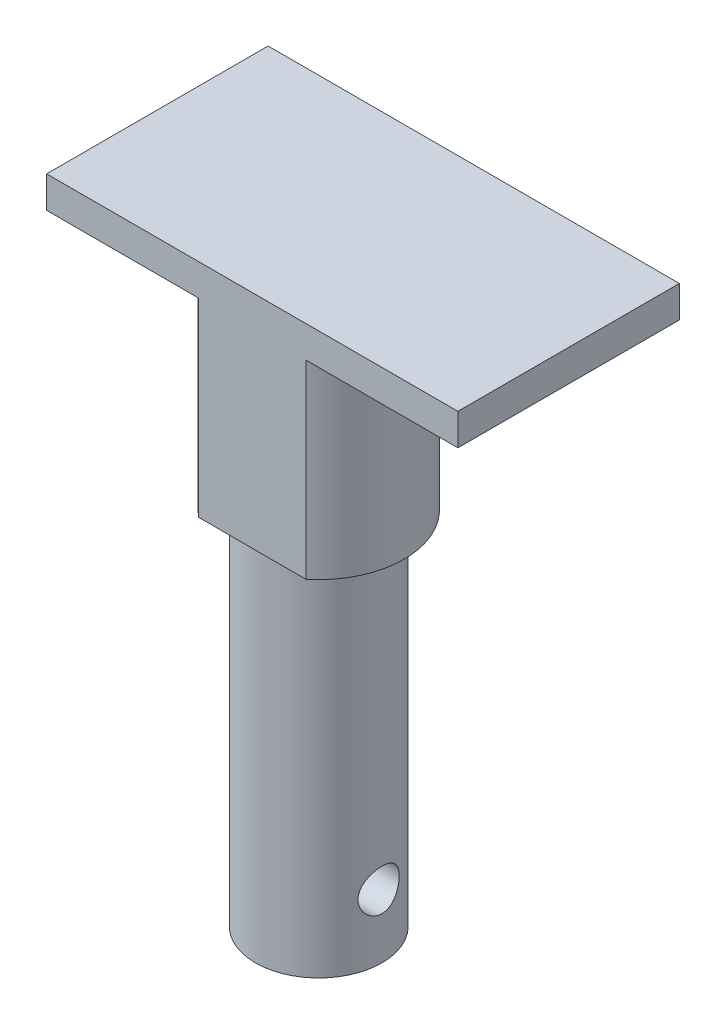
ISO-10303-21;
HEADER;
FILE_DESCRIPTION(('STEP AP214'),'2;1');
FILE_NAME('part.step','',(''),(''),'','','');
FILE_SCHEMA(('AUTOMOTIVE_DESIGN { 1 0 10303 214 1 1 1 1 }'));
ENDSEC;
DATA;
#1=APPLICATION_CONTEXT('core data for automotive mechanical design processes');
#2=APPLICATION_PROTOCOL_DEFINITION('international standard','automotive_design',2000,#1);
#3=PRODUCT_CONTEXT('',#1,'mechanical');
#4=PRODUCT('Part','Part','',(#3));
#5=PRODUCT_RELATED_PRODUCT_CATEGORY('part','',(#4));
#6=PRODUCT_DEFINITION_FORMATION('','',#4);
#7=PRODUCT_DEFINITION_CONTEXT('part definition',#1,'design');
#8=PRODUCT_DEFINITION('design','',#6,#7);
#9=PRODUCT_DEFINITION_SHAPE('','',#8);
#10=(LENGTH_UNIT() NAMED_UNIT(*) SI_UNIT(.MILLI.,.METRE.));
#11=(NAMED_UNIT(*) PLANE_ANGLE_UNIT() SI_UNIT($,.RADIAN.));
#12=(NAMED_UNIT(*) SI_UNIT($,.STERADIAN.) SOLID_ANGLE_UNIT());
#13=UNCERTAINTY_MEASURE_WITH_UNIT(LENGTH_MEASURE(1.E-05),#10,'distance_accuracy_value','');
#14=(GEOMETRIC_REPRESENTATION_CONTEXT(3) GLOBAL_UNCERTAINTY_ASSIGNED_CONTEXT((#13)) GLOBAL_UNIT_ASSIGNED_CONTEXT((#10,
#11,#12)) REPRESENTATION_CONTEXT('',''));
#15=CARTESIAN_POINT('',(0.,0.,0.));
#16=DIRECTION('',(0.,0.,1.));
#17=DIRECTION('',(1.,0.,0.));
#18=AXIS2_PLACEMENT_3D('',#15,#16,#17);
#19=CARTESIAN_POINT('',(0.,87.,0.));
#20=DIRECTION('',(0.,-1.,0.));
#21=DIRECTION('',(0.,0.,-1.));
#22=AXIS2_PLACEMENT_3D('',#19,#20,#21);
#23=CYLINDRICAL_SURFACE('',#22,13.5);
#24=DIRECTION('',(0.,-1.,0.));
#25=VECTOR('',#24,1.);
#26=CARTESIAN_POINT('',(-8.48528137423857,87.,10.5));
#27=LINE('',#26,#25);
#28=CARTESIAN_POINT('',(-8.48528137423857,87.,10.5));
#29=VERTEX_POINT('',#28);
#30=CARTESIAN_POINT('',(-8.48528137423857,57.,10.5));
#31=VERTEX_POINT('',#30);
#32=EDGE_CURVE('E52',#29,#31,#27,.T.);
#33=ORIENTED_EDGE('',*,*,#32,.F.);
#34=CARTESIAN_POINT('',(0.,87.,0.));
#35=DIRECTION('',(0.,1.,0.));
#36=DIRECTION('',(0.,0.,1.));
#37=AXIS2_PLACEMENT_3D('',#34,#35,#36);
#38=CIRCLE('',#37,13.5);
#39=CARTESIAN_POINT('',(8.48528137423857,87.,10.5));
#40=VERTEX_POINT('',#39);
#41=EDGE_CURVE('E120',#40,#29,#38,.T.);
#42=ORIENTED_EDGE('',*,*,#41,.F.);
#43=DIRECTION('',(0.,-1.,0.));
#44=VECTOR('',#43,1.);
#45=CARTESIAN_POINT('',(8.48528137423857,87.,10.5));
#46=LINE('',#45,#44);
#47=CARTESIAN_POINT('',(8.48528137423857,57.,10.5));
#48=VERTEX_POINT('',#47);
#49=EDGE_CURVE('E111',#48,#40,#46,.F.);
#50=ORIENTED_EDGE('',*,*,#49,.F.);
#51=CARTESIAN_POINT('',(0.,57.,0.));
#52=DIRECTION('',(0.,1.,0.));
#53=DIRECTION('',(0.,0.,1.));
#54=AXIS2_PLACEMENT_3D('',#51,#52,#53);
#55=CIRCLE('',#54,13.5);
#56=EDGE_CURVE('E124',#48,#31,#55,.T.);
#57=ORIENTED_EDGE('',*,*,#56,.T.);
#58=EDGE_LOOP('',(#33,#42,#50,#57));
#59=FACE_BOUND('',#58,.T.);
#60=ADVANCED_FACE('F37',(#59),#23,.T.);
#61=CARTESIAN_POINT('',(0.,57.,0.));
#62=DIRECTION('',(0.,1.,0.));
#63=DIRECTION('',(0.,0.,1.));
#64=AXIS2_PLACEMENT_3D('',#61,#62,#63);
#65=PLANE('',#64);
#66=CARTESIAN_POINT('',(0.,57.,0.));
#67=DIRECTION('',(0.,1.,0.));
#68=DIRECTION('',(0.,0.,1.));
#69=AXIS2_PLACEMENT_3D('',#66,#67,#68);
#70=CIRCLE('',#69,10.);
#71=CARTESIAN_POINT('',(0.,57.,10.));
#72=VERTEX_POINT('',#71);
#73=EDGE_CURVE('E46',#72,#72,#70,.T.);
#74=ORIENTED_EDGE('',*,*,#73,.T.);
#75=EDGE_LOOP('',(#74));
#76=FACE_BOUND('',#75,.T.);
#77=DIRECTION('',(1.,0.,0.));
#78=VECTOR('',#77,1.);
#79=CARTESIAN_POINT('',(0.,57.,10.5));
#80=LINE('',#79,#78);
#81=EDGE_CURVE('E11',#31,#48,#80,.T.);
#82=ORIENTED_EDGE('',*,*,#81,.F.);
#83=ORIENTED_EDGE('',*,*,#56,.F.);
#84=EDGE_LOOP('',(#82,#83));
#85=FACE_BOUND('',#84,.T.);
#86=ADVANCED_FACE('F148',(#76,#85),#65,.F.);
#87=CARTESIAN_POINT('',(0.,57.,0.));
#88=DIRECTION('',(0.,-1.,0.));
#89=DIRECTION('',(0.,0.,-1.));
#90=AXIS2_PLACEMENT_3D('',#87,#88,#89);
#91=CYLINDRICAL_SURFACE('',#90,10.);
#92=CARTESIAN_POINT('',(-9.45714015968886,10.,-3.25));
#93=CARTESIAN_POINT('',(-9.45714031975425,10.1772995309839,-3.2499999659442));
#94=CARTESIAN_POINT('',(-9.46218061553845,10.3546010790585,-3.23544233910947));
#95=CARTESIAN_POINT('',(-9.48169889974066,10.703969232438,-3.17778063387206));
#96=CARTESIAN_POINT('',(-9.49617883832327,10.8760347483252,-3.13467065672283));
#97=CARTESIAN_POINT('',(-9.5327668473651,11.2098161179656,-3.0215640876378));
#98=CARTESIAN_POINT('',(-9.55486055631605,11.3715507823397,-2.95161808731896));
#99=CARTESIAN_POINT('',(-9.60416619680662,11.6810392881496,-2.78699619388974));
#100=CARTESIAN_POINT('',(-9.63137916829215,11.8287902797076,-2.69231527451471));
#101=CARTESIAN_POINT('',(-9.68899176574426,12.1116102021404,-2.47714104411863));
#102=CARTESIAN_POINT('',(-9.7194679228496,12.2460831711087,-2.35588471696472));
#103=CARTESIAN_POINT('',(-9.77952436884652,12.4931889671246,-2.09263184494554));
#104=CARTESIAN_POINT('',(-9.80910452115729,12.6058184785023,-1.95063215712304));
#105=CARTESIAN_POINT('',(-9.86491782280745,12.8087140059434,-1.64559602796293));
#106=CARTESIAN_POINT('',(-9.89105042825693,12.8983599381405,-1.4821271180699));
#107=CARTESIAN_POINT('',(-9.93612574183379,13.0486489618789,-1.14143632793768));
#108=CARTESIAN_POINT('',(-9.95507028595168,13.1092994605284,-0.964217973560282));
#109=CARTESIAN_POINT('',(-9.98309301263069,13.1978676790573,-0.607303975463921));
#110=CARTESIAN_POINT('',(-9.99247790860662,13.2268053813106,-0.427885967277268));
#111=CARTESIAN_POINT('',(-10.0014104232845,13.2543650856266,-0.0665120376229357));
#112=CARTESIAN_POINT('',(-10.0009604553388,13.2529945249563,0.115443250276203));
#113=CARTESIAN_POINT('',(-9.99048411795755,13.2206333572229,0.469523771450081));
#114=CARTESIAN_POINT('',(-9.98081565195022,13.1907497247953,0.64176248294037));
#115=CARTESIAN_POINT('',(-9.95343429447756,13.1040354917331,0.978632246401624));
#116=CARTESIAN_POINT('',(-9.93572086532967,13.0472030899749,1.14326278907262));
#117=CARTESIAN_POINT('',(-9.89377411201858,12.9075321138005,1.46271759756166));
#118=CARTESIAN_POINT('',(-9.869460261881,12.824370079097,1.61738943124247));
#119=CARTESIAN_POINT('',(-9.81685615924599,12.6346641048776,1.91091693128666));
#120=CARTESIAN_POINT('',(-9.78856484119447,12.5281138954183,2.04976834129096));
#121=CARTESIAN_POINT('',(-9.72950106071725,12.289034672668,2.31430549384569));
#122=CARTESIAN_POINT('',(-9.69867422994171,12.1555541692841,2.4391204093666));
#123=CARTESIAN_POINT('',(-9.63909486372543,11.8692829094806,2.66486690355386));
#124=CARTESIAN_POINT('',(-9.61034261635581,11.7164894793945,2.76579516980328));
#125=CARTESIAN_POINT('',(-9.55787955588513,11.3932925275095,2.94202938013299));
#126=CARTESIAN_POINT('',(-9.53423890921102,11.222686441961,3.01698630603797));
#127=CARTESIAN_POINT('',(-9.49549194347806,10.8703153229128,3.13682094119598));
#128=CARTESIAN_POINT('',(-9.48038225830742,10.6885547221466,3.18171051560576));
#129=CARTESIAN_POINT('',(-9.46116378995736,10.3274324605214,3.23840120551586));
#130=CARTESIAN_POINT('',(-9.45660869381158,10.1483053768679,3.2515457753366));
#131=CARTESIAN_POINT('',(-9.45777099529463,9.7903836982702,3.24816506242597));
#132=CARTESIAN_POINT('',(-9.46348664335148,9.61158905189046,3.23164483295112));
#133=CARTESIAN_POINT('',(-9.48410320755962,9.26538409966181,3.17060807190337));
#134=CARTESIAN_POINT('',(-9.49870345169873,9.09779258764446,3.12700704786871));
#135=CARTESIAN_POINT('',(-9.53511831835134,8.77233155932164,3.01413526079061));
#136=CARTESIAN_POINT('',(-9.55693417915461,8.61446371723909,2.94486009149768));
#137=CARTESIAN_POINT('',(-9.60614721606396,8.3075968343669,2.78020029035675));
#138=CARTESIAN_POINT('',(-9.63369436385388,8.15901530427584,2.68408357895599));
#139=CARTESIAN_POINT('',(-9.69096725740346,7.87960276565996,2.46930881957965));
#140=CARTESIAN_POINT('',(-9.7206936131738,7.74877675676222,2.35064444508003));
#141=CARTESIAN_POINT('',(-9.780607139663,7.50245906587849,2.08774508026601));
#142=CARTESIAN_POINT('',(-9.8107540300733,7.38793237086563,1.94259422975942));
#143=CARTESIAN_POINT('',(-9.86677456184763,7.18480943727656,1.63439731618795));
#144=CARTESIAN_POINT('',(-9.89264837523296,7.09621215474873,1.47135197394192));
#145=CARTESIAN_POINT('',(-9.93707445650379,6.94829394845271,1.13289346303608));
#146=CARTESIAN_POINT('',(-9.95567674524018,6.8887722789617,0.957574938068063));
#147=CARTESIAN_POINT('',(-9.98368172068449,6.80028357541559,0.598697534609192));
#148=CARTESIAN_POINT('',(-9.99308754661658,6.77130611479243,0.415141490398973));
#149=CARTESIAN_POINT('',(-10.0014145744501,6.7456300739525,0.0538483383324492));
#150=CARTESIAN_POINT('',(-10.0007868427667,6.74754284113222,-0.123780796472686));
#151=CARTESIAN_POINT('',(-9.99021560869602,6.7801948794347,-0.476070007471436));
#152=CARTESIAN_POINT('',(-9.98027280013974,6.81093200358289,-0.650730303811703));
#153=CARTESIAN_POINT('',(-9.95234501872029,6.89945321826155,-0.98962088757608));
#154=CARTESIAN_POINT('',(-9.93447846708206,6.95683960647199,-1.15396550686853));
#155=CARTESIAN_POINT('',(-9.8925433503312,7.09666612050663,-1.47076416800393));
#156=CARTESIAN_POINT('',(-9.86847368418031,7.1791106945664,-1.62321609265708));
#157=CARTESIAN_POINT('',(-9.81555378161621,7.37011445259099,-1.91784189154064));
#158=CARTESIAN_POINT('',(-9.78656335044512,7.47950220761108,-2.05945312297857));
#159=CARTESIAN_POINT('',(-9.72743554627142,7.71985690512826,-2.32276630111765));
#160=CARTESIAN_POINT('',(-9.69729781882271,7.85083055867531,-2.44446203257074));
#161=CARTESIAN_POINT('',(-9.63796513947998,8.13638781097536,-2.66901287727712));
#162=CARTESIAN_POINT('',(-9.60884528614325,8.29166107253147,-2.77101345238615));
#163=CARTESIAN_POINT('',(-9.55622558839879,8.61804094314108,-2.94738303474979));
#164=CARTESIAN_POINT('',(-9.53272393962414,8.78914244417665,-3.02176091768745));
#165=CARTESIAN_POINT('',(-9.49550334814008,9.1315420841047,-3.13669494452506));
#166=CARTESIAN_POINT('',(-9.48127131053795,9.3021799092042,-3.17905105398648));
#167=CARTESIAN_POINT('',(-9.46209103822373,9.64854553088193,-3.23569936279266));
#168=CARTESIAN_POINT('',(-9.45714000104205,9.8242717746928,-3.25000003375398));
#169=CARTESIAN_POINT('',(-9.45714015968886,10.,-3.25));
#170=B_SPLINE_CURVE_WITH_KNOTS('',3,(#92,#93,#94,#95,#96,#97,#98,#99,#100,#101,#102,#103,#104,
#105,#106,#107,#108,#109,#110,#111,#112,#113,#114,#115,#116,#117,#118,#119,#120,#121,#122,#123,
#124,#125,#126,#127,#128,#129,#130,#131,#132,#133,#134,#135,#136,#137,#138,#139,#140,#141,#142,
#143,#144,#145,#146,#147,#148,#149,#150,#151,#152,#153,#154,#155,#156,#157,#158,#159,#160,#161,
#162,#163,#164,#165,#166,#167,#168,#169),.UNSPECIFIED.,.T.,.F.,(4,2,2,2,2,2,2,2,2,2,2,2,2,2,2,2,
2,2,2,2,2,2,2,2,2,2,2,2,2,2,2,2,2,2,2,2,2,2,4),(0.,0.531248505037184,1.06260679711988,
1.59296824911441,2.12343755726667,2.67180188546718,3.22024938614486,3.7822237298498,
4.34405443604299,4.88723029743208,5.43027287176746,5.95305557209681,6.47587321758633,
7.00538064397246,7.53503019539512,8.088456109055,8.64195872265875,9.20263474595129,
9.76308938511448,10.2993744444867,10.8355681589328,11.3545536787972,11.8736283092985,
12.4085390846316,12.9436001698433,13.5029364155139,14.0622501384863,14.6176456234264,
15.1728514571604,15.7031706450783,16.2334503354496,16.7560588347683,17.278760159833,
17.8201569265527,18.3617223320029,18.9231471315414,19.4843913784856,20.0110907944363,
20.5376311438056),.UNSPECIFIED.);
#171=CARTESIAN_POINT('',(-9.45714015968886,10.,-3.25));
#172=VERTEX_POINT('',#171);
#173=EDGE_CURVE('E127',#172,#172,#170,.T.);
#174=ORIENTED_EDGE('',*,*,#173,.T.);
#175=EDGE_LOOP('',(#174));
#176=FACE_BOUND('',#175,.T.);
#177=CARTESIAN_POINT('',(9.45714015968887,10.,-3.25));
#178=CARTESIAN_POINT('',(9.45714031975425,9.82270046901606,-3.2499999659442));
#179=CARTESIAN_POINT('',(9.46218061553845,9.64539892094155,-3.23544233910947));
#180=CARTESIAN_POINT('',(9.48169889974066,9.29603076756202,-3.17778063387206));
#181=CARTESIAN_POINT('',(9.49617883832327,9.12396525167484,-3.13467065672283));
#182=CARTESIAN_POINT('',(9.5327668473651,8.79018388203441,-3.0215640876378));
#183=CARTESIAN_POINT('',(9.55486055631605,8.62844921766033,-2.95161808731896));
#184=CARTESIAN_POINT('',(9.60416619680663,8.31896071185041,-2.78699619388974));
#185=CARTESIAN_POINT('',(9.63137916829215,8.17120972029238,-2.69231527451471));
#186=CARTESIAN_POINT('',(9.68899176574426,7.88838979785957,-2.47714104411863));
#187=CARTESIAN_POINT('',(9.7194679228496,7.75391682889129,-2.35588471696472));
#188=CARTESIAN_POINT('',(9.77952436884652,7.50681103287539,-2.09263184494554));
#189=CARTESIAN_POINT('',(9.80910452115729,7.39418152149766,-1.95063215712304));
#190=CARTESIAN_POINT('',(9.86491782280745,7.19128599405659,-1.64559602796293));
#191=CARTESIAN_POINT('',(9.89105042825693,7.10164006185954,-1.4821271180699));
#192=CARTESIAN_POINT('',(9.93612574183379,6.95135103812108,-1.14143632793768));
#193=CARTESIAN_POINT('',(9.95507028595168,6.8907005394716,-0.964217973560284));
#194=CARTESIAN_POINT('',(9.98309301263069,6.80213232094275,-0.607303975463923));
#195=CARTESIAN_POINT('',(9.99247790860662,6.77319461868942,-0.427885967277271));
#196=CARTESIAN_POINT('',(10.0014104232845,6.74563491437338,-0.0665120376229382));
#197=CARTESIAN_POINT('',(10.0009604553388,6.74700547504368,0.115443250276201));
#198=CARTESIAN_POINT('',(9.99048411795755,6.77936664277708,0.46952377145008));
#199=CARTESIAN_POINT('',(9.98081565195022,6.80925027520472,0.641762482940369));
#200=CARTESIAN_POINT('',(9.95343429447756,6.89596450826688,0.978632246401624));
#201=CARTESIAN_POINT('',(9.93572086532967,6.95279691002511,1.14326278907262));
#202=CARTESIAN_POINT('',(9.89377411201858,7.09246788619951,1.46271759756166));
#203=CARTESIAN_POINT('',(9.869460261881,7.17562992090305,1.61738943124247));
#204=CARTESIAN_POINT('',(9.81685615924599,7.36533589512239,1.91091693128666));
#205=CARTESIAN_POINT('',(9.78856484119447,7.47188610458166,2.04976834129096));
#206=CARTESIAN_POINT('',(9.72950106071725,7.71096532733197,2.31430549384569));
#207=CARTESIAN_POINT('',(9.69867422994171,7.84444583071594,2.4391204093666));
#208=CARTESIAN_POINT('',(9.63909486372543,8.13071709051935,2.66486690355386));
#209=CARTESIAN_POINT('',(9.61034261635581,8.28351052060549,2.76579516980328));
#210=CARTESIAN_POINT('',(9.55787955588513,8.60670747249051,2.94202938013299));
#211=CARTESIAN_POINT('',(9.53423890921102,8.77731355803904,3.01698630603797));
#212=CARTESIAN_POINT('',(9.49549194347806,9.12968467708717,3.13682094119597));
#213=CARTESIAN_POINT('',(9.48038225830742,9.31144527785337,3.18171051560576));
#214=CARTESIAN_POINT('',(9.46116378995736,9.67256753947856,3.23840120551586));
#215=CARTESIAN_POINT('',(9.45660869381158,9.85169462313214,3.2515457753366));
#216=CARTESIAN_POINT('',(9.45777099529463,10.2096163017298,3.24816506242597));
#217=CARTESIAN_POINT('',(9.46348664335147,10.3884109481095,3.23164483295112));
#218=CARTESIAN_POINT('',(9.48410320755962,10.7346159003382,3.17060807190337));
#219=CARTESIAN_POINT('',(9.49870345169873,10.9022074123555,3.12700704786872));
#220=CARTESIAN_POINT('',(9.53511831835134,11.2276684406784,3.01413526079061));
#221=CARTESIAN_POINT('',(9.55693417915461,11.3855362827609,2.94486009149769));
#222=CARTESIAN_POINT('',(9.60614721606395,11.6924031656331,2.78020029035675));
#223=CARTESIAN_POINT('',(9.63369436385388,11.8409846957242,2.684083578956));
#224=CARTESIAN_POINT('',(9.69096725740346,12.12039723434,2.46930881957966));
#225=CARTESIAN_POINT('',(9.7206936131738,12.2512232432378,2.35064444508003));
#226=CARTESIAN_POINT('',(9.780607139663,12.4975409341215,2.08774508026601));
#227=CARTESIAN_POINT('',(9.8107540300733,12.6120676291344,1.94259422975942));
#228=CARTESIAN_POINT('',(9.86677456184763,12.8151905627234,1.63439731618795));
#229=CARTESIAN_POINT('',(9.89264837523296,12.9037878452513,1.47135197394192));
#230=CARTESIAN_POINT('',(9.93707445650379,13.0517060515473,1.13289346303609));
#231=CARTESIAN_POINT('',(9.95567674524017,13.1112277210383,0.957574938068066));
#232=CARTESIAN_POINT('',(9.98368172068449,13.1997164245844,0.598697534609195));
#233=CARTESIAN_POINT('',(9.99308754661658,13.2286938852076,0.415141490398976));
#234=CARTESIAN_POINT('',(10.0014145744501,13.2543699260475,0.0538483383324525));
#235=CARTESIAN_POINT('',(10.0007868427667,13.2524571588678,-0.123780796472683));
#236=CARTESIAN_POINT('',(9.99021560869602,13.2198051205653,-0.476070007471433));
#237=CARTESIAN_POINT('',(9.98027280013974,13.1890679964171,-0.650730303811699));
#238=CARTESIAN_POINT('',(9.95234501872029,13.1005467817384,-0.989620887576076));
#239=CARTESIAN_POINT('',(9.93447846708206,13.043160393528,-1.15396550686852));
#240=CARTESIAN_POINT('',(9.8925433503312,12.9033338794934,-1.47076416800392));
#241=CARTESIAN_POINT('',(9.86847368418031,12.8208893054336,-1.62321609265707));
#242=CARTESIAN_POINT('',(9.81555378161621,12.629885547409,-1.91784189154063));
#243=CARTESIAN_POINT('',(9.78656335044512,12.5204977923889,-2.05945312297857));
#244=CARTESIAN_POINT('',(9.72743554627142,12.2801430948718,-2.32276630111765));
#245=CARTESIAN_POINT('',(9.69729781882271,12.1491694413247,-2.44446203257074));
#246=CARTESIAN_POINT('',(9.63796513947998,11.8636121890246,-2.66901287727712));
#247=CARTESIAN_POINT('',(9.60884528614325,11.7083389274685,-2.77101345238615));
#248=CARTESIAN_POINT('',(9.55622558839879,11.3819590568589,-2.94738303474979));
#249=CARTESIAN_POINT('',(9.53272393962414,11.2108575558233,-3.02176091768745));
#250=CARTESIAN_POINT('',(9.49550334814008,10.8684579158953,-3.13669494452506));
#251=CARTESIAN_POINT('',(9.48127131053795,10.6978200907958,-3.17905105398647));
#252=CARTESIAN_POINT('',(9.46209103822373,10.3514544691181,-3.23569936279266));
#253=CARTESIAN_POINT('',(9.45714000104206,10.1757282253072,-3.25000003375398));
#254=CARTESIAN_POINT('',(9.45714015968887,10.,-3.25));
#255=B_SPLINE_CURVE_WITH_KNOTS('',3,(#177,#178,#179,#180,#181,#182,#183,#184,#185,#186,#187,
#188,#189,#190,#191,#192,#193,#194,#195,#196,#197,#198,#199,#200,#201,#202,#203,#204,#205,#206,
#207,#208,#209,#210,#211,#212,#213,#214,#215,#216,#217,#218,#219,#220,#221,#222,#223,#224,#225,
#226,#227,#228,#229,#230,#231,#232,#233,#234,#235,#236,#237,#238,#239,#240,#241,#242,#243,#244,
#245,#246,#247,#248,#249,#250,#251,#252,#253,#254),.UNSPECIFIED.,.T.,.F.,(4,2,2,2,2,2,2,2,2,2,2,
2,2,2,2,2,2,2,2,2,2,2,2,2,2,2,2,2,2,2,2,2,2,2,2,2,2,2,4),(0.,0.531248505037183,1.06260679711988,
1.59296824911441,2.12343755726667,2.67180188546718,3.22024938614486,3.7822237298498,
4.34405443604298,4.88723029743207,5.43027287176745,5.95305557209681,6.47587321758633,
7.00538064397246,7.53503019539512,8.088456109055,8.64195872265874,9.20263474595129,
9.76308938511447,10.2993744444867,10.8355681589328,11.3545536787972,11.8736283092985,
12.4085390846316,12.9436001698433,13.5029364155139,14.0622501384862,14.6176456234264,
15.1728514571604,15.7031706450783,16.2334503354496,16.7560588347683,17.278760159833,
17.8201569265527,18.3617223320029,18.9231471315414,19.4843913784856,20.0110907944363,
20.5376311438056),.UNSPECIFIED.);
#256=CARTESIAN_POINT('',(9.45714015968887,10.,-3.25));
#257=VERTEX_POINT('',#256);
#258=EDGE_CURVE('E119',#257,#257,#255,.T.);
#259=ORIENTED_EDGE('',*,*,#258,.T.);
#260=EDGE_LOOP('',(#259));
#261=FACE_BOUND('',#260,.T.);
#262=ORIENTED_EDGE('',*,*,#73,.F.);
#263=EDGE_LOOP('',(#262));
#264=FACE_BOUND('',#263,.T.);
#265=CARTESIAN_POINT('',(0.,0.,0.));
#266=DIRECTION('',(0.,1.,0.));
#267=DIRECTION('',(0.,0.,1.));
#268=AXIS2_PLACEMENT_3D('',#265,#266,#267);
#269=CIRCLE('',#268,10.);
#270=CARTESIAN_POINT('',(0.,0.,10.));
#271=VERTEX_POINT('',#270);
#272=EDGE_CURVE('E123',#271,#271,#269,.T.);
#273=ORIENTED_EDGE('',*,*,#272,.T.);
#274=EDGE_LOOP('',(#273));
#275=FACE_BOUND('',#274,.T.);
#276=ADVANCED_FACE('F39',(#176,#261,#264,#275),#91,.T.);
#277=CARTESIAN_POINT('',(0.,0.,0.));
#278=DIRECTION('',(0.,1.,0.));
#279=DIRECTION('',(0.,0.,1.));
#280=AXIS2_PLACEMENT_3D('',#277,#278,#279);
#281=PLANE('',#280);
#282=ORIENTED_EDGE('',*,*,#272,.F.);
#283=EDGE_LOOP('',(#282));
#284=FACE_BOUND('',#283,.T.);
#285=ADVANCED_FACE('F145',(#284),#281,.F.);
#286=CARTESIAN_POINT('',(-13.5,10.,0.));
#287=DIRECTION('',(1.,0.,0.));
#288=DIRECTION('',(0.,0.,-1.));
#289=AXIS2_PLACEMENT_3D('',#286,#287,#288);
#290=CYLINDRICAL_SURFACE('',#289,3.25);
#291=ORIENTED_EDGE('',*,*,#258,.F.);
#292=EDGE_LOOP('',(#291));
#293=FACE_BOUND('',#292,.T.);
#294=ORIENTED_EDGE('',*,*,#173,.F.);
#295=EDGE_LOOP('',(#294));
#296=FACE_BOUND('',#295,.T.);
#297=ADVANCED_FACE('F140',(#293,#296),#290,.F.);
#298=CARTESIAN_POINT('',(-13.5,0.,10.5));
#299=DIRECTION('',(0.,0.,1.));
#300=DIRECTION('',(1.,0.,0.));
#301=AXIS2_PLACEMENT_3D('',#298,#299,#300);
#302=PLANE('',#301);
#303=ORIENTED_EDGE('',*,*,#32,.T.);
#304=ORIENTED_EDGE('',*,*,#81,.T.);
#305=ORIENTED_EDGE('',*,*,#49,.T.);
#306=DIRECTION('',(1.,0.,0.));
#307=VECTOR('',#306,1.);
#308=CARTESIAN_POINT('',(-32.5,87.,10.5));
#309=LINE('',#308,#307);
#310=CARTESIAN_POINT('',(32.5,87.,10.5));
#311=VERTEX_POINT('',#310);
#312=EDGE_CURVE('E175',#40,#311,#309,.T.);
#313=ORIENTED_EDGE('',*,*,#312,.T.);
#314=DIRECTION('',(0.,-1.,0.));
#315=VECTOR('',#314,1.);
#316=CARTESIAN_POINT('',(32.5,92.,10.5));
#317=LINE('',#316,#315);
#318=CARTESIAN_POINT('',(32.5,92.,10.5));
#319=VERTEX_POINT('',#318);
#320=EDGE_CURVE('E93',#319,#311,#317,.T.);
#321=ORIENTED_EDGE('',*,*,#320,.F.);
#322=DIRECTION('',(1.,0.,0.));
#323=VECTOR('',#322,1.);
#324=CARTESIAN_POINT('',(-32.5,92.,10.5));
#325=LINE('',#324,#323);
#326=CARTESIAN_POINT('',(-32.5,92.,10.5));
#327=VERTEX_POINT('',#326);
#328=EDGE_CURVE('E86',#327,#319,#325,.T.);
#329=ORIENTED_EDGE('',*,*,#328,.F.);
#330=DIRECTION('',(0.,-1.,0.));
#331=VECTOR('',#330,1.);
#332=CARTESIAN_POINT('',(-32.5,92.,10.5));
#333=LINE('',#332,#331);
#334=CARTESIAN_POINT('',(-32.5,87.,10.5));
#335=VERTEX_POINT('',#334);
#336=EDGE_CURVE('E90',#327,#335,#333,.T.);
#337=ORIENTED_EDGE('',*,*,#336,.T.);
#338=EDGE_CURVE('E178',#335,#29,#309,.T.);
#339=ORIENTED_EDGE('',*,*,#338,.T.);
#340=EDGE_LOOP('',(#303,#304,#305,#313,#321,#329,#337,#339));
#341=FACE_BOUND('',#340,.T.);
#342=ADVANCED_FACE('F88',(#341),#302,.T.);
#343=CARTESIAN_POINT('',(-32.5,92.,-24.5));
#344=DIRECTION('',(1.,0.,0.));
#345=DIRECTION('',(0.,0.,-1.));
#346=AXIS2_PLACEMENT_3D('',#343,#344,#345);
#347=PLANE('',#346);
#348=DIRECTION('',(0.,0.,1.));
#349=VECTOR('',#348,1.);
#350=CARTESIAN_POINT('',(-32.5,87.,-24.5));
#351=LINE('',#350,#349);
#352=CARTESIAN_POINT('',(-32.5,87.,-24.5));
#353=VERTEX_POINT('',#352);
#354=EDGE_CURVE('E110',#353,#335,#351,.T.);
#355=ORIENTED_EDGE('',*,*,#354,.T.);
#356=ORIENTED_EDGE('',*,*,#336,.F.);
#357=DIRECTION('',(0.,0.,1.));
#358=VECTOR('',#357,1.);
#359=CARTESIAN_POINT('',(-32.5,92.,-24.5));
#360=LINE('',#359,#358);
#361=CARTESIAN_POINT('',(-32.5,92.,-24.5));
#362=VERTEX_POINT('',#361);
#363=EDGE_CURVE('E97',#362,#327,#360,.T.);
#364=ORIENTED_EDGE('',*,*,#363,.F.);
#365=DIRECTION('',(0.,-1.,0.));
#366=VECTOR('',#365,1.);
#367=CARTESIAN_POINT('',(-32.5,92.,-24.5));
#368=LINE('',#367,#366);
#369=EDGE_CURVE('E191',#362,#353,#368,.T.);
#370=ORIENTED_EDGE('',*,*,#369,.T.);
#371=EDGE_LOOP('',(#355,#356,#364,#370));
#372=FACE_BOUND('',#371,.T.);
#373=ADVANCED_FACE('F108',(#372),#347,.F.);
#374=CARTESIAN_POINT('',(32.5,92.,-24.5));
#375=DIRECTION('',(-1.,0.,0.));
#376=DIRECTION('',(0.,0.,1.));
#377=AXIS2_PLACEMENT_3D('',#374,#375,#376);
#378=PLANE('',#377);
#379=DIRECTION('',(0.,0.,-1.));
#380=VECTOR('',#379,1.);
#381=CARTESIAN_POINT('',(32.5,87.,-24.5));
#382=LINE('',#381,#380);
#383=CARTESIAN_POINT('',(32.5,87.,-24.5));
#384=VERTEX_POINT('',#383);
#385=EDGE_CURVE('E183',#311,#384,#382,.T.);
#386=ORIENTED_EDGE('',*,*,#385,.T.);
#387=DIRECTION('',(0.,-1.,0.));
#388=VECTOR('',#387,1.);
#389=CARTESIAN_POINT('',(32.5,92.,-24.5));
#390=LINE('',#389,#388);
#391=CARTESIAN_POINT('',(32.5,92.,-24.5));
#392=VERTEX_POINT('',#391);
#393=EDGE_CURVE('E114',#392,#384,#390,.T.);
#394=ORIENTED_EDGE('',*,*,#393,.F.);
#395=DIRECTION('',(0.,0.,-1.));
#396=VECTOR('',#395,1.);
#397=CARTESIAN_POINT('',(32.5,92.,-24.5));
#398=LINE('',#397,#396);
#399=EDGE_CURVE('E96',#319,#392,#398,.T.);
#400=ORIENTED_EDGE('',*,*,#399,.F.);
#401=ORIENTED_EDGE('',*,*,#320,.T.);
#402=EDGE_LOOP('',(#386,#394,#400,#401));
#403=FACE_BOUND('',#402,.T.);
#404=ADVANCED_FACE('F181',(#403),#378,.F.);
#405=CARTESIAN_POINT('',(-32.5,92.,-24.5));
#406=DIRECTION('',(0.,0.,1.));
#407=DIRECTION('',(1.,0.,0.));
#408=AXIS2_PLACEMENT_3D('',#405,#406,#407);
#409=PLANE('',#408);
#410=DIRECTION('',(-1.,0.,0.));
#411=VECTOR('',#410,1.);
#412=CARTESIAN_POINT('',(-32.5,87.,-24.5));
#413=LINE('',#412,#411);
#414=EDGE_CURVE('E106',#384,#353,#413,.T.);
#415=ORIENTED_EDGE('',*,*,#414,.T.);
#416=ORIENTED_EDGE('',*,*,#369,.F.);
#417=DIRECTION('',(-1.,0.,0.));
#418=VECTOR('',#417,1.);
#419=CARTESIAN_POINT('',(-32.5,92.,-24.5));
#420=LINE('',#419,#418);
#421=EDGE_CURVE('E102',#392,#362,#420,.T.);
#422=ORIENTED_EDGE('',*,*,#421,.F.);
#423=ORIENTED_EDGE('',*,*,#393,.T.);
#424=EDGE_LOOP('',(#415,#416,#422,#423));
#425=FACE_BOUND('',#424,.T.);
#426=ADVANCED_FACE('F193',(#425),#409,.F.);
#427=CARTESIAN_POINT('',(0.,92.,0.));
#428=DIRECTION('',(0.,1.,0.));
#429=DIRECTION('',(0.,0.,1.));
#430=AXIS2_PLACEMENT_3D('',#427,#428,#429);
#431=PLANE('',#430);
#432=ORIENTED_EDGE('',*,*,#363,.T.);
#433=ORIENTED_EDGE('',*,*,#328,.T.);
#434=ORIENTED_EDGE('',*,*,#399,.T.);
#435=ORIENTED_EDGE('',*,*,#421,.T.);
#436=EDGE_LOOP('',(#432,#433,#434,#435));
#437=FACE_BOUND('',#436,.T.);
#438=ADVANCED_FACE('F100',(#437),#431,.T.);
#439=CARTESIAN_POINT('',(0.,87.,0.));
#440=DIRECTION('',(0.,1.,0.));
#441=DIRECTION('',(0.,0.,1.));
#442=AXIS2_PLACEMENT_3D('',#439,#440,#441);
#443=PLANE('',#442);
#444=ORIENTED_EDGE('',*,*,#312,.F.);
#445=ORIENTED_EDGE('',*,*,#41,.T.);
#446=ORIENTED_EDGE('',*,*,#338,.F.);
#447=ORIENTED_EDGE('',*,*,#354,.F.);
#448=ORIENTED_EDGE('',*,*,#414,.F.);
#449=ORIENTED_EDGE('',*,*,#385,.F.);
#450=EDGE_LOOP('',(#444,#445,#446,#447,#448,#449));
#451=FACE_BOUND('',#450,.T.);
#452=ADVANCED_FACE('F186',(#451),#443,.F.);
#453=CLOSED_SHELL('',(#60,#86,#276,#285,#297,#342,#373,#404,#426,#438,#452));
#454=MANIFOLD_SOLID_BREP('B2',#453);
#455=ADVANCED_BREP_SHAPE_REPRESENTATION('',(#18,#454),#14);
#456=SHAPE_DEFINITION_REPRESENTATION(#9,#455);
ENDSEC;
END-ISO-10303-21;
